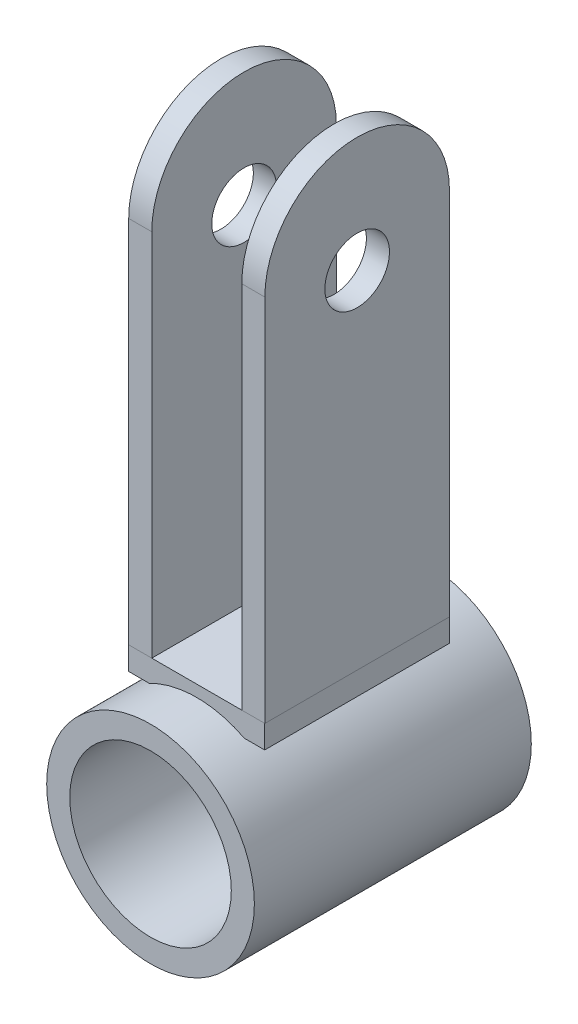
ISO-10303-21;
HEADER;
FILE_DESCRIPTION(('STEP AP214'),'2;1');
FILE_NAME('part.step','',(''),(''),'','','');
FILE_SCHEMA(('AUTOMOTIVE_DESIGN { 1 0 10303 214 1 1 1 1 }'));
ENDSEC;
DATA;
#1=APPLICATION_CONTEXT('core data for automotive mechanical design processes');
#2=APPLICATION_PROTOCOL_DEFINITION('international standard','automotive_design',2000,#1);
#3=PRODUCT_CONTEXT('',#1,'mechanical');
#4=PRODUCT('Part','Part','',(#3));
#5=PRODUCT_RELATED_PRODUCT_CATEGORY('part','',(#4));
#6=PRODUCT_DEFINITION_FORMATION('','',#4);
#7=PRODUCT_DEFINITION_CONTEXT('part definition',#1,'design');
#8=PRODUCT_DEFINITION('design','',#6,#7);
#9=PRODUCT_DEFINITION_SHAPE('','',#8);
#10=(LENGTH_UNIT() NAMED_UNIT(*) SI_UNIT(.MILLI.,.METRE.));
#11=(NAMED_UNIT(*) PLANE_ANGLE_UNIT() SI_UNIT($,.RADIAN.));
#12=(NAMED_UNIT(*) SI_UNIT($,.STERADIAN.) SOLID_ANGLE_UNIT());
#13=UNCERTAINTY_MEASURE_WITH_UNIT(LENGTH_MEASURE(1.E-05),#10,'distance_accuracy_value','');
#14=(GEOMETRIC_REPRESENTATION_CONTEXT(3) GLOBAL_UNCERTAINTY_ASSIGNED_CONTEXT((#13)) GLOBAL_UNIT_ASSIGNED_CONTEXT((#10,
#11,#12)) REPRESENTATION_CONTEXT('',''));
#15=CARTESIAN_POINT('',(0.,0.,0.));
#16=DIRECTION('',(0.,0.,1.));
#17=DIRECTION('',(1.,0.,0.));
#18=AXIS2_PLACEMENT_3D('',#15,#16,#17);
#19=CARTESIAN_POINT('',(14.7689462881927,0.,20.));
#20=DIRECTION('',(0.,0.,1.));
#21=DIRECTION('',(1.,0.,0.));
#22=AXIS2_PLACEMENT_3D('',#19,#20,#21);
#23=PLANE('',#22);
#24=DIRECTION('',(0.,1.,0.));
#25=VECTOR('',#24,1.);
#26=CARTESIAN_POINT('',(9.7689462881927,0.,20.));
#27=LINE('',#26,#25);
#28=CARTESIAN_POINT('',(9.7689462881927,25.,20.));
#29=VERTEX_POINT('',#28);
#30=CARTESIAN_POINT('',(9.7689462881927,105.,20.));
#31=VERTEX_POINT('',#30);
#32=EDGE_CURVE('E133',#29,#31,#27,.T.);
#33=ORIENTED_EDGE('',*,*,#32,.F.);
#34=DIRECTION('',(-1.,0.,0.));
#35=VECTOR('',#34,1.);
#36=CARTESIAN_POINT('',(14.7689462881927,25.,20.));
#37=LINE('',#36,#35);
#38=CARTESIAN_POINT('',(14.7689462881927,25.,20.));
#39=VERTEX_POINT('',#38);
#40=EDGE_CURVE('E12',#39,#29,#37,.T.);
#41=ORIENTED_EDGE('',*,*,#40,.F.);
#42=DIRECTION('',(0.,1.,0.));
#43=VECTOR('',#42,1.);
#44=CARTESIAN_POINT('',(14.7689462881927,0.,20.));
#45=LINE('',#44,#43);
#46=CARTESIAN_POINT('',(14.7689462881927,105.,20.));
#47=VERTEX_POINT('',#46);
#48=EDGE_CURVE('E119',#39,#47,#45,.T.);
#49=ORIENTED_EDGE('',*,*,#48,.T.);
#50=DIRECTION('',(-1.,0.,0.));
#51=VECTOR('',#50,1.);
#52=CARTESIAN_POINT('',(14.7689462881927,105.,20.));
#53=LINE('',#52,#51);
#54=EDGE_CURVE('E58',#47,#31,#53,.T.);
#55=ORIENTED_EDGE('',*,*,#54,.T.);
#56=EDGE_LOOP('',(#33,#41,#49,#55));
#57=FACE_BOUND('',#56,.T.);
#58=ADVANCED_FACE('F54',(#57),#23,.T.);
#59=CARTESIAN_POINT('',(14.7689462881927,25.,0.));
#60=DIRECTION('',(0.,1.,0.));
#61=DIRECTION('',(0.,0.,1.));
#62=AXIS2_PLACEMENT_3D('',#59,#60,#61);
#63=PLANE('',#62);
#64=DIRECTION('',(0.,0.,-1.));
#65=VECTOR('',#64,1.);
#66=CARTESIAN_POINT('',(9.7689462881927,25.,0.));
#67=LINE('',#66,#65);
#68=CARTESIAN_POINT('',(9.7689462881927,25.,-20.));
#69=VERTEX_POINT('',#68);
#70=EDGE_CURVE('E142',#29,#69,#67,.T.);
#71=ORIENTED_EDGE('',*,*,#70,.T.);
#72=DIRECTION('',(-1.,0.,0.));
#73=VECTOR('',#72,1.);
#74=CARTESIAN_POINT('',(14.7689462881927,25.,-20.));
#75=LINE('',#74,#73);
#76=CARTESIAN_POINT('',(14.7689462881927,25.,-20.));
#77=VERTEX_POINT('',#76);
#78=EDGE_CURVE('E65',#77,#69,#75,.T.);
#79=ORIENTED_EDGE('',*,*,#78,.F.);
#80=DIRECTION('',(0.,0.,-1.));
#81=VECTOR('',#80,1.);
#82=CARTESIAN_POINT('',(14.7689462881927,25.,0.));
#83=LINE('',#82,#81);
#84=EDGE_CURVE('E109',#39,#77,#83,.T.);
#85=ORIENTED_EDGE('',*,*,#84,.F.);
#86=ORIENTED_EDGE('',*,*,#40,.T.);
#87=EDGE_LOOP('',(#71,#79,#85,#86));
#88=FACE_BOUND('',#87,.T.);
#89=ADVANCED_FACE('F147',(#88),#63,.F.);
#90=CARTESIAN_POINT('',(14.7689462881927,0.,-20.));
#91=DIRECTION('',(0.,0.,1.));
#92=DIRECTION('',(1.,0.,0.));
#93=AXIS2_PLACEMENT_3D('',#90,#91,#92);
#94=PLANE('',#93);
#95=DIRECTION('',(0.,1.,0.));
#96=VECTOR('',#95,1.);
#97=CARTESIAN_POINT('',(9.7689462881927,0.,-20.));
#98=LINE('',#97,#96);
#99=CARTESIAN_POINT('',(9.7689462881927,105.,-20.));
#100=VERTEX_POINT('',#99);
#101=EDGE_CURVE('E90',#69,#100,#98,.T.);
#102=ORIENTED_EDGE('',*,*,#101,.T.);
#103=DIRECTION('',(-1.,0.,0.));
#104=VECTOR('',#103,1.);
#105=CARTESIAN_POINT('',(14.7689462881927,105.,-20.));
#106=LINE('',#105,#104);
#107=CARTESIAN_POINT('',(14.7689462881927,105.,-20.));
#108=VERTEX_POINT('',#107);
#109=EDGE_CURVE('E114',#108,#100,#106,.T.);
#110=ORIENTED_EDGE('',*,*,#109,.F.);
#111=DIRECTION('',(0.,1.,0.));
#112=VECTOR('',#111,1.);
#113=CARTESIAN_POINT('',(14.7689462881927,0.,-20.));
#114=LINE('',#113,#112);
#115=EDGE_CURVE('E104',#77,#108,#114,.T.);
#116=ORIENTED_EDGE('',*,*,#115,.F.);
#117=ORIENTED_EDGE('',*,*,#78,.T.);
#118=EDGE_LOOP('',(#102,#110,#116,#117));
#119=FACE_BOUND('',#118,.T.);
#120=ADVANCED_FACE('F115',(#119),#94,.F.);
#121=CARTESIAN_POINT('',(14.7689462881927,100.,0.));
#122=DIRECTION('',(-1.,0.,0.));
#123=DIRECTION('',(0.,0.,1.));
#124=AXIS2_PLACEMENT_3D('',#121,#122,#123);
#125=CYLINDRICAL_SURFACE('',#124,7.);
#126=CARTESIAN_POINT('',(14.7689462881927,100.,0.));
#127=DIRECTION('',(-1.,0.,0.));
#128=DIRECTION('',(0.,0.,1.));
#129=AXIS2_PLACEMENT_3D('',#126,#127,#128);
#130=CIRCLE('',#129,7.);
#131=CARTESIAN_POINT('',(14.7689462881927,100.,6.99999999999999));
#132=VERTEX_POINT('',#131);
#133=EDGE_CURVE('E123',#132,#132,#130,.T.);
#134=ORIENTED_EDGE('',*,*,#133,.F.);
#135=EDGE_LOOP('',(#134));
#136=FACE_BOUND('',#135,.T.);
#137=CARTESIAN_POINT('',(9.7689462881927,100.,0.));
#138=DIRECTION('',(-1.,0.,0.));
#139=DIRECTION('',(0.,0.,1.));
#140=AXIS2_PLACEMENT_3D('',#137,#138,#139);
#141=CIRCLE('',#140,7.);
#142=CARTESIAN_POINT('',(9.7689462881927,100.,6.99999999999999));
#143=VERTEX_POINT('',#142);
#144=EDGE_CURVE('E129',#143,#143,#141,.T.);
#145=ORIENTED_EDGE('',*,*,#144,.T.);
#146=EDGE_LOOP('',(#145));
#147=FACE_BOUND('',#146,.T.);
#148=ADVANCED_FACE('F56',(#136,#147),#125,.F.);
#149=CARTESIAN_POINT('',(14.7689462881927,105.,0.));
#150=DIRECTION('',(-1.,0.,0.));
#151=DIRECTION('',(0.,0.,1.));
#152=AXIS2_PLACEMENT_3D('',#149,#150,#151);
#153=CYLINDRICAL_SURFACE('',#152,20.);
#154=CARTESIAN_POINT('',(9.7689462881927,105.,0.));
#155=DIRECTION('',(-1.,0.,0.));
#156=DIRECTION('',(0.,0.,1.));
#157=AXIS2_PLACEMENT_3D('',#154,#155,#156);
#158=CIRCLE('',#157,20.);
#159=EDGE_CURVE('E137',#31,#100,#158,.T.);
#160=ORIENTED_EDGE('',*,*,#159,.F.);
#161=ORIENTED_EDGE('',*,*,#54,.F.);
#162=CARTESIAN_POINT('',(14.7689462881927,105.,0.));
#163=DIRECTION('',(-1.,0.,0.));
#164=DIRECTION('',(0.,0.,1.));
#165=AXIS2_PLACEMENT_3D('',#162,#163,#164);
#166=CIRCLE('',#165,20.);
#167=EDGE_CURVE('E108',#47,#108,#166,.T.);
#168=ORIENTED_EDGE('',*,*,#167,.T.);
#169=ORIENTED_EDGE('',*,*,#109,.T.);
#170=EDGE_LOOP('',(#160,#161,#168,#169));
#171=FACE_BOUND('',#170,.T.);
#172=ADVANCED_FACE('F117',(#171),#153,.T.);
#173=CARTESIAN_POINT('',(14.7689462881927,0.,0.));
#174=DIRECTION('',(-1.,0.,0.));
#175=DIRECTION('',(0.,0.,1.));
#176=AXIS2_PLACEMENT_3D('',#173,#174,#175);
#177=PLANE('',#176);
#178=ORIENTED_EDGE('',*,*,#133,.T.);
#179=EDGE_LOOP('',(#178));
#180=FACE_BOUND('',#179,.T.);
#181=ORIENTED_EDGE('',*,*,#48,.F.);
#182=ORIENTED_EDGE('',*,*,#84,.T.);
#183=ORIENTED_EDGE('',*,*,#115,.T.);
#184=ORIENTED_EDGE('',*,*,#167,.F.);
#185=EDGE_LOOP('',(#181,#182,#183,#184));
#186=FACE_BOUND('',#185,.T.);
#187=ADVANCED_FACE('F107',(#180,#186),#177,.F.);
#188=CARTESIAN_POINT('',(9.7689462881927,0.,0.));
#189=DIRECTION('',(-1.,0.,0.));
#190=DIRECTION('',(0.,0.,1.));
#191=AXIS2_PLACEMENT_3D('',#188,#189,#190);
#192=PLANE('',#191);
#193=ORIENTED_EDGE('',*,*,#144,.F.);
#194=EDGE_LOOP('',(#193));
#195=FACE_BOUND('',#194,.T.);
#196=ORIENTED_EDGE('',*,*,#32,.T.);
#197=ORIENTED_EDGE('',*,*,#159,.T.);
#198=ORIENTED_EDGE('',*,*,#101,.F.);
#199=ORIENTED_EDGE('',*,*,#70,.F.);
#200=EDGE_LOOP('',(#196,#197,#198,#199));
#201=FACE_BOUND('',#200,.T.);
#202=ADVANCED_FACE('F148',(#195,#201),#192,.T.);
#203=CLOSED_SHELL('',(#58,#89,#120,#148,#172,#187,#202));
#204=MANIFOLD_SOLID_BREP('B2',#203);
#205=CARTESIAN_POINT('',(-9.7310537118073,0.,20.));
#206=DIRECTION('',(0.,0.,1.));
#207=DIRECTION('',(1.,0.,0.));
#208=AXIS2_PLACEMENT_3D('',#205,#206,#207);
#209=PLANE('',#208);
#210=DIRECTION('',(0.,1.,0.));
#211=VECTOR('',#210,1.);
#212=CARTESIAN_POINT('',(-14.7310537118073,0.,20.));
#213=LINE('',#212,#211);
#214=CARTESIAN_POINT('',(-14.7310537118073,25.,20.));
#215=VERTEX_POINT('',#214);
#216=CARTESIAN_POINT('',(-14.7310537118073,105.,20.));
#217=VERTEX_POINT('',#216);
#218=EDGE_CURVE('E321',#215,#217,#213,.T.);
#219=ORIENTED_EDGE('',*,*,#218,.F.);
#220=DIRECTION('',(-1.,0.,0.));
#221=VECTOR('',#220,1.);
#222=CARTESIAN_POINT('',(-9.7310537118073,25.,20.));
#223=LINE('',#222,#221);
#224=CARTESIAN_POINT('',(-9.7310537118073,25.,20.));
#225=VERTEX_POINT('',#224);
#226=EDGE_CURVE('E52',#225,#215,#223,.T.);
#227=ORIENTED_EDGE('',*,*,#226,.F.);
#228=DIRECTION('',(0.,1.,0.));
#229=VECTOR('',#228,1.);
#230=CARTESIAN_POINT('',(-9.7310537118073,0.,20.));
#231=LINE('',#230,#229);
#232=CARTESIAN_POINT('',(-9.7310537118073,105.,20.));
#233=VERTEX_POINT('',#232);
#234=EDGE_CURVE('E307',#225,#233,#231,.T.);
#235=ORIENTED_EDGE('',*,*,#234,.T.);
#236=DIRECTION('',(-1.,0.,0.));
#237=VECTOR('',#236,1.);
#238=CARTESIAN_POINT('',(-9.7310537118073,105.,20.));
#239=LINE('',#238,#237);
#240=EDGE_CURVE('E246',#233,#217,#239,.T.);
#241=ORIENTED_EDGE('',*,*,#240,.T.);
#242=EDGE_LOOP('',(#219,#227,#235,#241));
#243=FACE_BOUND('',#242,.T.);
#244=ADVANCED_FACE('F242',(#243),#209,.T.);
#245=CARTESIAN_POINT('',(-9.7310537118073,25.,0.));
#246=DIRECTION('',(0.,1.,0.));
#247=DIRECTION('',(0.,0.,1.));
#248=AXIS2_PLACEMENT_3D('',#245,#246,#247);
#249=PLANE('',#248);
#250=DIRECTION('',(0.,0.,-1.));
#251=VECTOR('',#250,1.);
#252=CARTESIAN_POINT('',(-14.7310537118073,25.,0.));
#253=LINE('',#252,#251);
#254=CARTESIAN_POINT('',(-14.7310537118073,25.,-20.));
#255=VERTEX_POINT('',#254);
#256=EDGE_CURVE('E330',#215,#255,#253,.T.);
#257=ORIENTED_EDGE('',*,*,#256,.T.);
#258=DIRECTION('',(-1.,0.,0.));
#259=VECTOR('',#258,1.);
#260=CARTESIAN_POINT('',(-9.7310537118073,25.,-20.));
#261=LINE('',#260,#259);
#262=CARTESIAN_POINT('',(-9.7310537118073,25.,-20.));
#263=VERTEX_POINT('',#262);
#264=EDGE_CURVE('E253',#263,#255,#261,.T.);
#265=ORIENTED_EDGE('',*,*,#264,.F.);
#266=DIRECTION('',(0.,0.,-1.));
#267=VECTOR('',#266,1.);
#268=CARTESIAN_POINT('',(-9.7310537118073,25.,0.));
#269=LINE('',#268,#267);
#270=EDGE_CURVE('E297',#225,#263,#269,.T.);
#271=ORIENTED_EDGE('',*,*,#270,.F.);
#272=ORIENTED_EDGE('',*,*,#226,.T.);
#273=EDGE_LOOP('',(#257,#265,#271,#272));
#274=FACE_BOUND('',#273,.T.);
#275=ADVANCED_FACE('F335',(#274),#249,.F.);
#276=CARTESIAN_POINT('',(-9.7310537118073,0.,-20.));
#277=DIRECTION('',(0.,0.,1.));
#278=DIRECTION('',(1.,0.,0.));
#279=AXIS2_PLACEMENT_3D('',#276,#277,#278);
#280=PLANE('',#279);
#281=DIRECTION('',(0.,1.,0.));
#282=VECTOR('',#281,1.);
#283=CARTESIAN_POINT('',(-14.7310537118073,0.,-20.));
#284=LINE('',#283,#282);
#285=CARTESIAN_POINT('',(-14.7310537118073,105.,-20.));
#286=VERTEX_POINT('',#285);
#287=EDGE_CURVE('E278',#255,#286,#284,.T.);
#288=ORIENTED_EDGE('',*,*,#287,.T.);
#289=DIRECTION('',(-1.,0.,0.));
#290=VECTOR('',#289,1.);
#291=CARTESIAN_POINT('',(-9.7310537118073,105.,-20.));
#292=LINE('',#291,#290);
#293=CARTESIAN_POINT('',(-9.7310537118073,105.,-20.));
#294=VERTEX_POINT('',#293);
#295=EDGE_CURVE('E302',#294,#286,#292,.T.);
#296=ORIENTED_EDGE('',*,*,#295,.F.);
#297=DIRECTION('',(0.,1.,0.));
#298=VECTOR('',#297,1.);
#299=CARTESIAN_POINT('',(-9.7310537118073,0.,-20.));
#300=LINE('',#299,#298);
#301=EDGE_CURVE('E292',#263,#294,#300,.T.);
#302=ORIENTED_EDGE('',*,*,#301,.F.);
#303=ORIENTED_EDGE('',*,*,#264,.T.);
#304=EDGE_LOOP('',(#288,#296,#302,#303));
#305=FACE_BOUND('',#304,.T.);
#306=ADVANCED_FACE('F303',(#305),#280,.F.);
#307=CARTESIAN_POINT('',(-9.7310537118073,100.,0.));
#308=DIRECTION('',(-1.,0.,0.));
#309=DIRECTION('',(0.,0.,1.));
#310=AXIS2_PLACEMENT_3D('',#307,#308,#309);
#311=CYLINDRICAL_SURFACE('',#310,7.);
#312=CARTESIAN_POINT('',(-9.7310537118073,100.,0.));
#313=DIRECTION('',(-1.,0.,0.));
#314=DIRECTION('',(0.,0.,1.));
#315=AXIS2_PLACEMENT_3D('',#312,#313,#314);
#316=CIRCLE('',#315,7.);
#317=CARTESIAN_POINT('',(-9.7310537118073,100.,7.));
#318=VERTEX_POINT('',#317);
#319=EDGE_CURVE('E311',#318,#318,#316,.T.);
#320=ORIENTED_EDGE('',*,*,#319,.F.);
#321=EDGE_LOOP('',(#320));
#322=FACE_BOUND('',#321,.T.);
#323=CARTESIAN_POINT('',(-14.7310537118073,100.,0.));
#324=DIRECTION('',(-1.,0.,0.));
#325=DIRECTION('',(0.,0.,1.));
#326=AXIS2_PLACEMENT_3D('',#323,#324,#325);
#327=CIRCLE('',#326,7.);
#328=CARTESIAN_POINT('',(-14.7310537118073,100.,7.));
#329=VERTEX_POINT('',#328);
#330=EDGE_CURVE('E317',#329,#329,#327,.T.);
#331=ORIENTED_EDGE('',*,*,#330,.T.);
#332=EDGE_LOOP('',(#331));
#333=FACE_BOUND('',#332,.T.);
#334=ADVANCED_FACE('F244',(#322,#333),#311,.F.);
#335=CARTESIAN_POINT('',(-9.7310537118073,105.,0.));
#336=DIRECTION('',(-1.,0.,0.));
#337=DIRECTION('',(0.,0.,1.));
#338=AXIS2_PLACEMENT_3D('',#335,#336,#337);
#339=CYLINDRICAL_SURFACE('',#338,20.);
#340=CARTESIAN_POINT('',(-14.7310537118073,105.,0.));
#341=DIRECTION('',(-1.,0.,0.));
#342=DIRECTION('',(0.,0.,1.));
#343=AXIS2_PLACEMENT_3D('',#340,#341,#342);
#344=CIRCLE('',#343,20.);
#345=EDGE_CURVE('E325',#217,#286,#344,.T.);
#346=ORIENTED_EDGE('',*,*,#345,.F.);
#347=ORIENTED_EDGE('',*,*,#240,.F.);
#348=CARTESIAN_POINT('',(-9.7310537118073,105.,0.));
#349=DIRECTION('',(-1.,0.,0.));
#350=DIRECTION('',(0.,0.,1.));
#351=AXIS2_PLACEMENT_3D('',#348,#349,#350);
#352=CIRCLE('',#351,20.);
#353=EDGE_CURVE('E296',#233,#294,#352,.T.);
#354=ORIENTED_EDGE('',*,*,#353,.T.);
#355=ORIENTED_EDGE('',*,*,#295,.T.);
#356=EDGE_LOOP('',(#346,#347,#354,#355));
#357=FACE_BOUND('',#356,.T.);
#358=ADVANCED_FACE('F305',(#357),#339,.T.);
#359=CARTESIAN_POINT('',(-9.7310537118073,0.,0.));
#360=DIRECTION('',(-1.,0.,0.));
#361=DIRECTION('',(0.,0.,1.));
#362=AXIS2_PLACEMENT_3D('',#359,#360,#361);
#363=PLANE('',#362);
#364=ORIENTED_EDGE('',*,*,#319,.T.);
#365=EDGE_LOOP('',(#364));
#366=FACE_BOUND('',#365,.T.);
#367=ORIENTED_EDGE('',*,*,#234,.F.);
#368=ORIENTED_EDGE('',*,*,#270,.T.);
#369=ORIENTED_EDGE('',*,*,#301,.T.);
#370=ORIENTED_EDGE('',*,*,#353,.F.);
#371=EDGE_LOOP('',(#367,#368,#369,#370));
#372=FACE_BOUND('',#371,.T.);
#373=ADVANCED_FACE('F295',(#366,#372),#363,.F.);
#374=CARTESIAN_POINT('',(-14.7310537118073,0.,0.));
#375=DIRECTION('',(-1.,0.,0.));
#376=DIRECTION('',(0.,0.,1.));
#377=AXIS2_PLACEMENT_3D('',#374,#375,#376);
#378=PLANE('',#377);
#379=ORIENTED_EDGE('',*,*,#330,.F.);
#380=EDGE_LOOP('',(#379));
#381=FACE_BOUND('',#380,.T.);
#382=ORIENTED_EDGE('',*,*,#218,.T.);
#383=ORIENTED_EDGE('',*,*,#345,.T.);
#384=ORIENTED_EDGE('',*,*,#287,.F.);
#385=ORIENTED_EDGE('',*,*,#256,.F.);
#386=EDGE_LOOP('',(#382,#383,#384,#385));
#387=FACE_BOUND('',#386,.T.);
#388=ADVANCED_FACE('F336',(#381,#387),#378,.T.);
#389=CLOSED_SHELL('',(#244,#275,#306,#334,#358,#373,#388));
#390=MANIFOLD_SOLID_BREP('B6',#389);
#391=CARTESIAN_POINT('',(0.,0.,30.));
#392=DIRECTION('',(0.,0.,-1.));
#393=DIRECTION('',(-1.,0.,0.));
#394=AXIS2_PLACEMENT_3D('',#391,#392,#393);
#395=CYLINDRICAL_SURFACE('',#394,22.5);
#396=CARTESIAN_POINT('',(0.,0.,-30.));
#397=DIRECTION('',(0.,0.,1.));
#398=DIRECTION('',(1.,0.,0.));
#399=AXIS2_PLACEMENT_3D('',#396,#397,#398);
#400=CIRCLE('',#399,22.5);
#401=CARTESIAN_POINT('',(22.5,0.,-30.));
#402=VERTEX_POINT('',#401);
#403=EDGE_CURVE('E513',#402,#402,#400,.T.);
#404=ORIENTED_EDGE('',*,*,#403,.T.);
#405=EDGE_LOOP('',(#404));
#406=FACE_BOUND('',#405,.T.);
#407=CARTESIAN_POINT('',(0.,0.,30.));
#408=DIRECTION('',(0.,0.,1.));
#409=DIRECTION('',(1.,0.,0.));
#410=AXIS2_PLACEMENT_3D('',#407,#408,#409);
#411=CIRCLE('',#410,22.5);
#412=CARTESIAN_POINT('',(22.5,0.,30.));
#413=VERTEX_POINT('',#412);
#414=EDGE_CURVE('E515',#413,#413,#411,.T.);
#415=ORIENTED_EDGE('',*,*,#414,.F.);
#416=EDGE_LOOP('',(#415));
#417=FACE_BOUND('',#416,.T.);
#418=DIRECTION('',(0.,0.,-1.));
#419=VECTOR('',#418,1.);
#420=CARTESIAN_POINT('',(10.3077640640442,20.,30.));
#421=LINE('',#420,#419);
#422=CARTESIAN_POINT('',(10.3077640640442,20.,20.));
#423=VERTEX_POINT('',#422);
#424=CARTESIAN_POINT('',(10.3077640640442,20.,-20.));
#425=VERTEX_POINT('',#424);
#426=EDGE_CURVE('E240',#423,#425,#421,.T.);
#427=ORIENTED_EDGE('',*,*,#426,.F.);
#428=CARTESIAN_POINT('',(0.,0.,20.));
#429=DIRECTION('',(0.,0.,-1.));
#430=DIRECTION('',(-1.,0.,0.));
#431=AXIS2_PLACEMENT_3D('',#428,#429,#430);
#432=CIRCLE('',#431,22.5);
#433=CARTESIAN_POINT('',(-10.3077640640442,20.,20.));
#434=VERTEX_POINT('',#433);
#435=EDGE_CURVE('E429',#434,#423,#432,.T.);
#436=ORIENTED_EDGE('',*,*,#435,.F.);
#437=DIRECTION('',(0.,0.,-1.));
#438=VECTOR('',#437,1.);
#439=CARTESIAN_POINT('',(-10.3077640640442,20.,30.));
#440=LINE('',#439,#438);
#441=CARTESIAN_POINT('',(-10.3077640640442,20.,-20.));
#442=VERTEX_POINT('',#441);
#443=EDGE_CURVE('E519',#442,#434,#440,.F.);
#444=ORIENTED_EDGE('',*,*,#443,.F.);
#445=CARTESIAN_POINT('',(0.,0.,-20.));
#446=DIRECTION('',(0.,0.,1.));
#447=DIRECTION('',(1.,0.,0.));
#448=AXIS2_PLACEMENT_3D('',#445,#446,#447);
#449=CIRCLE('',#448,22.5);
#450=EDGE_CURVE('E439',#425,#442,#449,.T.);
#451=ORIENTED_EDGE('',*,*,#450,.F.);
#452=EDGE_LOOP('',(#427,#436,#444,#451));
#453=FACE_BOUND('',#452,.T.);
#454=ADVANCED_FACE('F421',(#406,#417,#453),#395,.T.);
#455=CARTESIAN_POINT('',(0.,0.,30.));
#456=DIRECTION('',(0.,0.,1.));
#457=DIRECTION('',(1.,0.,0.));
#458=AXIS2_PLACEMENT_3D('',#455,#456,#457);
#459=PLANE('',#458);
#460=ORIENTED_EDGE('',*,*,#414,.T.);
#461=EDGE_LOOP('',(#460));
#462=FACE_BOUND('',#461,.T.);
#463=CARTESIAN_POINT('',(0.,0.,30.));
#464=DIRECTION('',(0.,0.,1.));
#465=DIRECTION('',(1.,0.,0.));
#466=AXIS2_PLACEMENT_3D('',#463,#464,#465);
#467=CIRCLE('',#466,17.5);
#468=CARTESIAN_POINT('',(17.5,0.,30.));
#469=VERTEX_POINT('',#468);
#470=EDGE_CURVE('E505',#469,#469,#467,.T.);
#471=ORIENTED_EDGE('',*,*,#470,.F.);
#472=EDGE_LOOP('',(#471));
#473=FACE_BOUND('',#472,.T.);
#474=ADVANCED_FACE('F578',(#462,#473),#459,.T.);
#475=CARTESIAN_POINT('',(0.,0.,-30.));
#476=DIRECTION('',(0.,0.,1.));
#477=DIRECTION('',(1.,0.,0.));
#478=AXIS2_PLACEMENT_3D('',#475,#476,#477);
#479=PLANE('',#478);
#480=ORIENTED_EDGE('',*,*,#403,.F.);
#481=EDGE_LOOP('',(#480));
#482=FACE_BOUND('',#481,.T.);
#483=CARTESIAN_POINT('',(0.,0.,-30.));
#484=DIRECTION('',(0.,0.,1.));
#485=DIRECTION('',(1.,0.,0.));
#486=AXIS2_PLACEMENT_3D('',#483,#484,#485);
#487=CIRCLE('',#486,17.5);
#488=CARTESIAN_POINT('',(17.5,0.,-30.));
#489=VERTEX_POINT('',#488);
#490=EDGE_CURVE('E499',#489,#489,#487,.T.);
#491=ORIENTED_EDGE('',*,*,#490,.T.);
#492=EDGE_LOOP('',(#491));
#493=FACE_BOUND('',#492,.T.);
#494=ADVANCED_FACE('F585',(#482,#493),#479,.F.);
#495=CARTESIAN_POINT('',(0.,0.,30.));
#496=DIRECTION('',(0.,0.,-1.));
#497=DIRECTION('',(-1.,0.,0.));
#498=AXIS2_PLACEMENT_3D('',#495,#496,#497);
#499=CYLINDRICAL_SURFACE('',#498,17.5);
#500=ORIENTED_EDGE('',*,*,#470,.T.);
#501=EDGE_LOOP('',(#500));
#502=FACE_BOUND('',#501,.T.);
#503=ORIENTED_EDGE('',*,*,#490,.F.);
#504=EDGE_LOOP('',(#503));
#505=FACE_BOUND('',#504,.T.);
#506=ADVANCED_FACE('F594',(#502,#505),#499,.F.);
#507=CARTESIAN_POINT('',(0.,20.,0.));
#508=DIRECTION('',(0.,1.,0.));
#509=DIRECTION('',(0.,0.,1.));
#510=AXIS2_PLACEMENT_3D('',#507,#508,#509);
#511=PLANE('',#510);
#512=DIRECTION('',(1.,0.,0.));
#513=VECTOR('',#512,1.);
#514=CARTESIAN_POINT('',(14.7310537118073,20.,20.));
#515=LINE('',#514,#513);
#516=CARTESIAN_POINT('',(14.7310537118073,20.,20.));
#517=VERTEX_POINT('',#516);
#518=EDGE_CURVE('E530',#423,#517,#515,.T.);
#519=ORIENTED_EDGE('',*,*,#518,.F.);
#520=ORIENTED_EDGE('',*,*,#426,.T.);
#521=DIRECTION('',(-1.,0.,0.));
#522=VECTOR('',#521,1.);
#523=CARTESIAN_POINT('',(14.7310537118073,20.,-20.));
#524=LINE('',#523,#522);
#525=CARTESIAN_POINT('',(14.7310537118073,20.,-20.));
#526=VERTEX_POINT('',#525);
#527=EDGE_CURVE('E493',#526,#425,#524,.T.);
#528=ORIENTED_EDGE('',*,*,#527,.F.);
#529=DIRECTION('',(0.,0.,-1.));
#530=VECTOR('',#529,1.);
#531=CARTESIAN_POINT('',(14.7310537118073,20.,20.));
#532=LINE('',#531,#530);
#533=EDGE_CURVE('E537',#517,#526,#532,.T.);
#534=ORIENTED_EDGE('',*,*,#533,.F.);
#535=EDGE_LOOP('',(#519,#520,#528,#534));
#536=FACE_BOUND('',#535,.T.);
#537=ADVANCED_FACE('F534',(#536),#511,.F.);
#538=CARTESIAN_POINT('',(-14.7310537118073,20.,-20.));
#539=VERTEX_POINT('',#538);
#540=EDGE_CURVE('E548',#442,#539,#524,.T.);
#541=ORIENTED_EDGE('',*,*,#540,.F.);
#542=ORIENTED_EDGE('',*,*,#443,.T.);
#543=CARTESIAN_POINT('',(-14.7310537118073,20.,20.));
#544=VERTEX_POINT('',#543);
#545=EDGE_CURVE('E531',#544,#434,#515,.T.);
#546=ORIENTED_EDGE('',*,*,#545,.F.);
#547=DIRECTION('',(0.,0.,1.));
#548=VECTOR('',#547,1.);
#549=CARTESIAN_POINT('',(-14.7310537118073,20.,20.));
#550=LINE('',#549,#548);
#551=EDGE_CURVE('E497',#539,#544,#550,.T.);
#552=ORIENTED_EDGE('',*,*,#551,.F.);
#553=EDGE_LOOP('',(#541,#542,#546,#552));
#554=FACE_BOUND('',#553,.T.);
#555=ADVANCED_FACE('F576',(#554),#511,.F.);
#556=CARTESIAN_POINT('',(-14.7310537118073,25.,20.));
#557=DIRECTION('',(1.,0.,0.));
#558=DIRECTION('',(0.,0.,-1.));
#559=AXIS2_PLACEMENT_3D('',#556,#557,#558);
#560=PLANE('',#559);
#561=ORIENTED_EDGE('',*,*,#551,.T.);
#562=DIRECTION('',(0.,-1.,0.));
#563=VECTOR('',#562,1.);
#564=CARTESIAN_POINT('',(-14.7310537118073,25.,20.));
#565=LINE('',#564,#563);
#566=CARTESIAN_POINT('',(-14.7310537118073,25.,20.));
#567=VERTEX_POINT('',#566);
#568=EDGE_CURVE('E475',#567,#544,#565,.T.);
#569=ORIENTED_EDGE('',*,*,#568,.F.);
#570=DIRECTION('',(0.,0.,1.));
#571=VECTOR('',#570,1.);
#572=CARTESIAN_POINT('',(-14.7310537118073,25.,20.));
#573=LINE('',#572,#571);
#574=CARTESIAN_POINT('',(-14.7310537118073,25.,-20.));
#575=VERTEX_POINT('',#574);
#576=EDGE_CURVE('E483',#575,#567,#573,.T.);
#577=ORIENTED_EDGE('',*,*,#576,.F.);
#578=DIRECTION('',(0.,-1.,0.));
#579=VECTOR('',#578,1.);
#580=CARTESIAN_POINT('',(-14.7310537118073,25.,-20.));
#581=LINE('',#580,#579);
#582=EDGE_CURVE('E551',#575,#539,#581,.T.);
#583=ORIENTED_EDGE('',*,*,#582,.T.);
#584=EDGE_LOOP('',(#561,#569,#577,#583));
#585=FACE_BOUND('',#584,.T.);
#586=ADVANCED_FACE('F495',(#585),#560,.F.);
#587=CARTESIAN_POINT('',(14.7310537118073,25.,20.));
#588=DIRECTION('',(0.,0.,-1.));
#589=DIRECTION('',(-1.,0.,0.));
#590=AXIS2_PLACEMENT_3D('',#587,#588,#589);
#591=PLANE('',#590);
#592=ORIENTED_EDGE('',*,*,#545,.T.);
#593=ORIENTED_EDGE('',*,*,#435,.T.);
#594=ORIENTED_EDGE('',*,*,#518,.T.);
#595=DIRECTION('',(0.,-1.,0.));
#596=VECTOR('',#595,1.);
#597=CARTESIAN_POINT('',(14.7310537118073,25.,20.));
#598=LINE('',#597,#596);
#599=CARTESIAN_POINT('',(14.7310537118073,25.,20.));
#600=VERTEX_POINT('',#599);
#601=EDGE_CURVE('E478',#600,#517,#598,.T.);
#602=ORIENTED_EDGE('',*,*,#601,.F.);
#603=DIRECTION('',(1.,0.,0.));
#604=VECTOR('',#603,1.);
#605=CARTESIAN_POINT('',(14.7310537118073,25.,20.));
#606=LINE('',#605,#604);
#607=EDGE_CURVE('E470',#567,#600,#606,.T.);
#608=ORIENTED_EDGE('',*,*,#607,.F.);
#609=ORIENTED_EDGE('',*,*,#568,.T.);
#610=EDGE_LOOP('',(#592,#593,#594,#602,#608,#609));
#611=FACE_BOUND('',#610,.T.);
#612=ADVANCED_FACE('F473',(#611),#591,.F.);
#613=CARTESIAN_POINT('',(14.7310537118073,25.,20.));
#614=DIRECTION('',(-1.,0.,0.));
#615=DIRECTION('',(0.,0.,1.));
#616=AXIS2_PLACEMENT_3D('',#613,#614,#615);
#617=PLANE('',#616);
#618=ORIENTED_EDGE('',*,*,#533,.T.);
#619=DIRECTION('',(0.,-1.,0.));
#620=VECTOR('',#619,1.);
#621=CARTESIAN_POINT('',(14.7310537118073,25.,-20.));
#622=LINE('',#621,#620);
#623=CARTESIAN_POINT('',(14.7310537118073,25.,-20.));
#624=VERTEX_POINT('',#623);
#625=EDGE_CURVE('E507',#624,#526,#622,.T.);
#626=ORIENTED_EDGE('',*,*,#625,.F.);
#627=DIRECTION('',(0.,0.,-1.));
#628=VECTOR('',#627,1.);
#629=CARTESIAN_POINT('',(14.7310537118073,25.,20.));
#630=LINE('',#629,#628);
#631=EDGE_CURVE('E482',#600,#624,#630,.T.);
#632=ORIENTED_EDGE('',*,*,#631,.F.);
#633=ORIENTED_EDGE('',*,*,#601,.T.);
#634=EDGE_LOOP('',(#618,#626,#632,#633));
#635=FACE_BOUND('',#634,.T.);
#636=ADVANCED_FACE('F560',(#635),#617,.F.);
#637=CARTESIAN_POINT('',(14.7310537118073,25.,-20.));
#638=DIRECTION('',(0.,0.,1.));
#639=DIRECTION('',(1.,0.,0.));
#640=AXIS2_PLACEMENT_3D('',#637,#638,#639);
#641=PLANE('',#640);
#642=ORIENTED_EDGE('',*,*,#527,.T.);
#643=ORIENTED_EDGE('',*,*,#450,.T.);
#644=ORIENTED_EDGE('',*,*,#540,.T.);
#645=ORIENTED_EDGE('',*,*,#582,.F.);
#646=DIRECTION('',(-1.,0.,0.));
#647=VECTOR('',#646,1.);
#648=CARTESIAN_POINT('',(14.7310537118073,25.,-20.));
#649=LINE('',#648,#647);
#650=EDGE_CURVE('E488',#624,#575,#649,.T.);
#651=ORIENTED_EDGE('',*,*,#650,.F.);
#652=ORIENTED_EDGE('',*,*,#625,.T.);
#653=EDGE_LOOP('',(#642,#643,#644,#645,#651,#652));
#654=FACE_BOUND('',#653,.T.);
#655=ADVANCED_FACE('F558',(#654),#641,.F.);
#656=CARTESIAN_POINT('',(0.,25.,0.));
#657=DIRECTION('',(0.,1.,0.));
#658=DIRECTION('',(0.,0.,1.));
#659=AXIS2_PLACEMENT_3D('',#656,#657,#658);
#660=PLANE('',#659);
#661=ORIENTED_EDGE('',*,*,#576,.T.);
#662=ORIENTED_EDGE('',*,*,#607,.T.);
#663=ORIENTED_EDGE('',*,*,#631,.T.);
#664=ORIENTED_EDGE('',*,*,#650,.T.);
#665=EDGE_LOOP('',(#661,#662,#663,#664));
#666=FACE_BOUND('',#665,.T.);
#667=ADVANCED_FACE('F486',(#666),#660,.T.);
#668=CLOSED_SHELL('',(#454,#474,#494,#506,#537,#555,#586,#612,#636,#655,#667));
#669=MANIFOLD_SOLID_BREP('B46',#668);
#670=ADVANCED_BREP_SHAPE_REPRESENTATION('',(#18,#204,#390,#669),#14);
#671=SHAPE_DEFINITION_REPRESENTATION(#9,#670);
ENDSEC;
END-ISO-10303-21;
